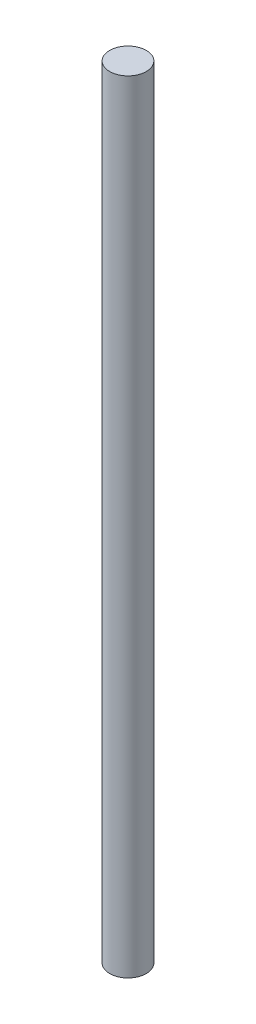
ISO-10303-21;
HEADER;
FILE_DESCRIPTION(('STEP AP214'),'2;1');
FILE_NAME('part.step','',(''),(''),'','','');
FILE_SCHEMA(('AUTOMOTIVE_DESIGN { 1 0 10303 214 1 1 1 1 }'));
ENDSEC;
DATA;
#1=APPLICATION_CONTEXT('core data for automotive mechanical design processes');
#2=APPLICATION_PROTOCOL_DEFINITION('international standard','automotive_design',2000,#1);
#3=PRODUCT_CONTEXT('',#1,'mechanical');
#4=PRODUCT('Part','Part','',(#3));
#5=PRODUCT_RELATED_PRODUCT_CATEGORY('part','',(#4));
#6=PRODUCT_DEFINITION_FORMATION('','',#4);
#7=PRODUCT_DEFINITION_CONTEXT('part definition',#1,'design');
#8=PRODUCT_DEFINITION('design','',#6,#7);
#9=PRODUCT_DEFINITION_SHAPE('','',#8);
#10=(LENGTH_UNIT() NAMED_UNIT(*) SI_UNIT(.MILLI.,.METRE.));
#11=(NAMED_UNIT(*) PLANE_ANGLE_UNIT() SI_UNIT($,.RADIAN.));
#12=(NAMED_UNIT(*) SI_UNIT($,.STERADIAN.) SOLID_ANGLE_UNIT());
#13=UNCERTAINTY_MEASURE_WITH_UNIT(LENGTH_MEASURE(1.E-05),#10,'distance_accuracy_value','');
#14=(GEOMETRIC_REPRESENTATION_CONTEXT(3) GLOBAL_UNCERTAINTY_ASSIGNED_CONTEXT((#13)) GLOBAL_UNIT_ASSIGNED_CONTEXT((#10,
#11,#12)) REPRESENTATION_CONTEXT('',''));
#15=CARTESIAN_POINT('',(0.,0.,0.));
#16=DIRECTION('',(0.,0.,1.));
#17=DIRECTION('',(1.,0.,0.));
#18=AXIS2_PLACEMENT_3D('',#15,#16,#17);
#19=CARTESIAN_POINT('',(0.,128.,0.));
#20=DIRECTION('',(0.,-1.,0.));
#21=DIRECTION('',(0.,0.,-1.));
#22=AXIS2_PLACEMENT_3D('',#19,#20,#21);
#23=CYLINDRICAL_SURFACE('',#22,3.);
#24=CARTESIAN_POINT('',(0.,128.,0.));
#25=DIRECTION('',(0.,1.,0.));
#26=DIRECTION('',(0.,0.,1.));
#27=AXIS2_PLACEMENT_3D('',#24,#25,#26);
#28=CIRCLE('',#27,3.);
#29=CARTESIAN_POINT('',(0.,128.,3.));
#30=VERTEX_POINT('',#29);
#31=EDGE_CURVE('E10',#30,#30,#28,.T.);
#32=ORIENTED_EDGE('',*,*,#31,.F.);
#33=EDGE_LOOP('',(#32));
#34=FACE_BOUND('',#33,.T.);
#35=CARTESIAN_POINT('',(0.,0.,0.));
#36=DIRECTION('',(0.,1.,0.));
#37=DIRECTION('',(0.,0.,1.));
#38=AXIS2_PLACEMENT_3D('',#35,#36,#37);
#39=CIRCLE('',#38,3.);
#40=CARTESIAN_POINT('',(0.,0.,3.));
#41=VERTEX_POINT('',#40);
#42=EDGE_CURVE('E37',#41,#41,#39,.T.);
#43=ORIENTED_EDGE('',*,*,#42,.T.);
#44=EDGE_LOOP('',(#43));
#45=FACE_BOUND('',#44,.T.);
#46=ADVANCED_FACE('F40',(#34,#45),#23,.T.);
#47=CARTESIAN_POINT('',(0.,128.,0.));
#48=DIRECTION('',(0.,1.,0.));
#49=DIRECTION('',(0.,0.,1.));
#50=AXIS2_PLACEMENT_3D('',#47,#48,#49);
#51=PLANE('',#50);
#52=ORIENTED_EDGE('',*,*,#31,.T.);
#53=EDGE_LOOP('',(#52));
#54=FACE_BOUND('',#53,.T.);
#55=ADVANCED_FACE('F55',(#54),#51,.T.);
#56=CARTESIAN_POINT('',(0.,0.,0.));
#57=DIRECTION('',(0.,1.,0.));
#58=DIRECTION('',(0.,0.,1.));
#59=AXIS2_PLACEMENT_3D('',#56,#57,#58);
#60=PLANE('',#59);
#61=ORIENTED_EDGE('',*,*,#42,.F.);
#62=EDGE_LOOP('',(#61));
#63=FACE_BOUND('',#62,.T.);
#64=ADVANCED_FACE('F49',(#63),#60,.F.);
#65=CLOSED_SHELL('',(#46,#55,#64));
#66=MANIFOLD_SOLID_BREP('B2',#65);
#67=ADVANCED_BREP_SHAPE_REPRESENTATION('',(#18,#66),#14);
#68=SHAPE_DEFINITION_REPRESENTATION(#9,#67);
ENDSEC;
END-ISO-10303-21;
